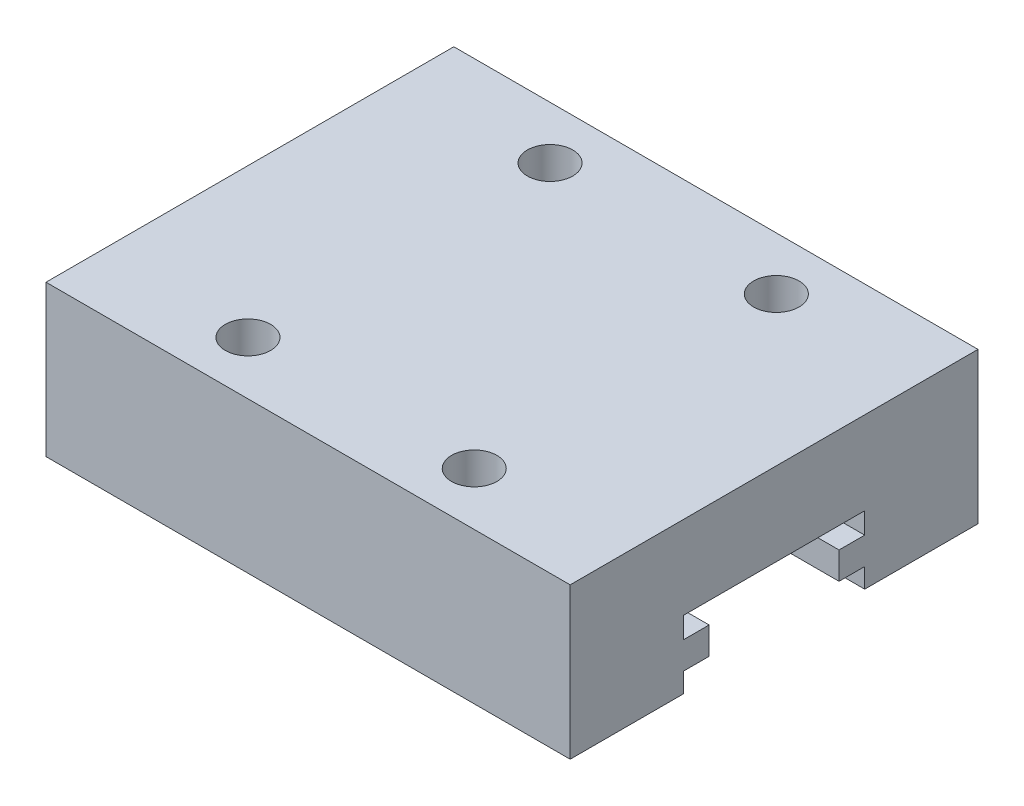
ISO-10303-21;
HEADER;
FILE_DESCRIPTION(('STEP AP214'),'2;1');
FILE_NAME('part.step','',(''),(''),'','','');
FILE_SCHEMA(('AUTOMOTIVE_DESIGN { 1 0 10303 214 1 1 1 1 }'));
ENDSEC;
DATA;
#1=APPLICATION_CONTEXT('core data for automotive mechanical design processes');
#2=APPLICATION_PROTOCOL_DEFINITION('international standard','automotive_design',2000,#1);
#3=PRODUCT_CONTEXT('',#1,'mechanical');
#4=PRODUCT('Part','Part','',(#3));
#5=PRODUCT_RELATED_PRODUCT_CATEGORY('part','',(#4));
#6=PRODUCT_DEFINITION_FORMATION('','',#4);
#7=PRODUCT_DEFINITION_CONTEXT('part definition',#1,'design');
#8=PRODUCT_DEFINITION('design','',#6,#7);
#9=PRODUCT_DEFINITION_SHAPE('','',#8);
#10=(LENGTH_UNIT() NAMED_UNIT(*) SI_UNIT(.MILLI.,.METRE.));
#11=(NAMED_UNIT(*) PLANE_ANGLE_UNIT() SI_UNIT($,.RADIAN.));
#12=(NAMED_UNIT(*) SI_UNIT($,.STERADIAN.) SOLID_ANGLE_UNIT());
#13=UNCERTAINTY_MEASURE_WITH_UNIT(LENGTH_MEASURE(1.E-05),#10,'distance_accuracy_value','');
#14=(GEOMETRIC_REPRESENTATION_CONTEXT(3) GLOBAL_UNCERTAINTY_ASSIGNED_CONTEXT((#13)) GLOBAL_UNIT_ASSIGNED_CONTEXT((#10,
#11,#12)) REPRESENTATION_CONTEXT('',''));
#15=CARTESIAN_POINT('',(0.,0.,0.));
#16=DIRECTION('',(0.,0.,1.));
#17=DIRECTION('',(1.,0.,0.));
#18=AXIS2_PLACEMENT_3D('',#15,#16,#17);
#19=CARTESIAN_POINT('',(0.,0.,0.));
#20=DIRECTION('',(0.,-1.,0.));
#21=DIRECTION('',(0.,0.,-1.));
#22=AXIS2_PLACEMENT_3D('',#19,#20,#21);
#23=PLANE('',#22);
#24=DIRECTION('',(1.,0.,0.));
#25=VECTOR('',#24,1.);
#26=CARTESIAN_POINT('',(-12.8160056179763,0.,-7.5));
#27=LINE('',#26,#25);
#28=CARTESIAN_POINT('',(0.,0.,-7.5));
#29=VERTEX_POINT('',#28);
#30=CARTESIAN_POINT('',(34.7,0.,-7.5));
#31=VERTEX_POINT('',#30);
#32=EDGE_CURVE('E192',#29,#31,#27,.T.);
#33=ORIENTED_EDGE('',*,*,#32,.T.);
#34=DIRECTION('',(0.,0.,-1.));
#35=VECTOR('',#34,1.);
#36=CARTESIAN_POINT('',(34.7,0.,0.));
#37=LINE('',#36,#35);
#38=CARTESIAN_POINT('',(34.7,0.,0.));
#39=VERTEX_POINT('',#38);
#40=EDGE_CURVE('E207',#39,#31,#37,.T.);
#41=ORIENTED_EDGE('',*,*,#40,.F.);
#42=DIRECTION('',(1.,0.,0.));
#43=VECTOR('',#42,1.);
#44=CARTESIAN_POINT('',(0.,0.,0.));
#45=LINE('',#44,#43);
#46=CARTESIAN_POINT('',(0.,0.,0.));
#47=VERTEX_POINT('',#46);
#48=EDGE_CURVE('E224',#47,#39,#45,.T.);
#49=ORIENTED_EDGE('',*,*,#48,.F.);
#50=DIRECTION('',(0.,0.,1.));
#51=VECTOR('',#50,1.);
#52=CARTESIAN_POINT('',(0.,0.,0.));
#53=LINE('',#52,#51);
#54=EDGE_CURVE('E208',#29,#47,#53,.T.);
#55=ORIENTED_EDGE('',*,*,#54,.F.);
#56=EDGE_LOOP('',(#33,#41,#49,#55));
#57=FACE_BOUND('',#56,.T.);
#58=ADVANCED_FACE('F40',(#57),#23,.T.);
#59=CARTESIAN_POINT('',(0.,10.,0.));
#60=DIRECTION('',(1.,0.,0.));
#61=DIRECTION('',(0.,0.,-1.));
#62=AXIS2_PLACEMENT_3D('',#59,#60,#61);
#63=PLANE('',#62);
#64=DIRECTION('',(0.,0.,-1.));
#65=VECTOR('',#64,1.);
#66=CARTESIAN_POINT('',(0.,1.3,-7.5));
#67=LINE('',#66,#65);
#68=CARTESIAN_POINT('',(0.,1.3,-7.5));
#69=VERTEX_POINT('',#68);
#70=CARTESIAN_POINT('',(0.,1.3,-9.2));
#71=VERTEX_POINT('',#70);
#72=EDGE_CURVE('E401',#69,#71,#67,.T.);
#73=ORIENTED_EDGE('',*,*,#72,.F.);
#74=DIRECTION('',(0.,1.,0.));
#75=VECTOR('',#74,1.);
#76=CARTESIAN_POINT('',(0.,0.,-7.5));
#77=LINE('',#76,#75);
#78=EDGE_CURVE('E267',#29,#69,#77,.T.);
#79=ORIENTED_EDGE('',*,*,#78,.F.);
#80=ORIENTED_EDGE('',*,*,#54,.T.);
#81=DIRECTION('',(0.,-1.,0.));
#82=VECTOR('',#81,1.);
#83=CARTESIAN_POINT('',(0.,10.,0.));
#84=LINE('',#83,#82);
#85=CARTESIAN_POINT('',(0.,10.,0.));
#86=VERTEX_POINT('',#85);
#87=EDGE_CURVE('E11',#86,#47,#84,.T.);
#88=ORIENTED_EDGE('',*,*,#87,.F.);
#89=DIRECTION('',(0.,0.,1.));
#90=VECTOR('',#89,1.);
#91=CARTESIAN_POINT('',(0.,10.,0.));
#92=LINE('',#91,#90);
#93=CARTESIAN_POINT('',(0.,10.,-27.));
#94=VERTEX_POINT('',#93);
#95=EDGE_CURVE('E221',#94,#86,#92,.T.);
#96=ORIENTED_EDGE('',*,*,#95,.F.);
#97=DIRECTION('',(0.,-1.,0.));
#98=VECTOR('',#97,1.);
#99=CARTESIAN_POINT('',(0.,10.,-27.));
#100=LINE('',#99,#98);
#101=CARTESIAN_POINT('',(0.,0.,-27.));
#102=VERTEX_POINT('',#101);
#103=EDGE_CURVE('E228',#94,#102,#100,.T.);
#104=ORIENTED_EDGE('',*,*,#103,.T.);
#105=CARTESIAN_POINT('',(0.,0.,-19.5));
#106=VERTEX_POINT('',#105);
#107=EDGE_CURVE('E238',#102,#106,#53,.T.);
#108=ORIENTED_EDGE('',*,*,#107,.T.);
#109=DIRECTION('',(0.,-1.,0.));
#110=VECTOR('',#109,1.);
#111=CARTESIAN_POINT('',(0.,0.,-19.5));
#112=LINE('',#111,#110);
#113=CARTESIAN_POINT('',(0.,1.3,-19.5));
#114=VERTEX_POINT('',#113);
#115=EDGE_CURVE('E59',#114,#106,#112,.T.);
#116=ORIENTED_EDGE('',*,*,#115,.F.);
#117=DIRECTION('',(0.,0.,-1.));
#118=VECTOR('',#117,1.);
#119=CARTESIAN_POINT('',(0.,1.3,-19.5));
#120=LINE('',#119,#118);
#121=CARTESIAN_POINT('',(0.,1.3,-17.8));
#122=VERTEX_POINT('',#121);
#123=EDGE_CURVE('E375',#122,#114,#120,.T.);
#124=ORIENTED_EDGE('',*,*,#123,.F.);
#125=DIRECTION('',(0.,-1.,0.));
#126=VECTOR('',#125,1.);
#127=CARTESIAN_POINT('',(0.,3.1,-17.8));
#128=LINE('',#127,#126);
#129=CARTESIAN_POINT('',(0.,3.1,-17.8));
#130=VERTEX_POINT('',#129);
#131=EDGE_CURVE('E381',#130,#122,#128,.T.);
#132=ORIENTED_EDGE('',*,*,#131,.F.);
#133=DIRECTION('',(0.,0.,1.));
#134=VECTOR('',#133,1.);
#135=CARTESIAN_POINT('',(0.,3.1,-19.5));
#136=LINE('',#135,#134);
#137=CARTESIAN_POINT('',(0.,3.1,-19.5));
#138=VERTEX_POINT('',#137);
#139=EDGE_CURVE('E388',#138,#130,#136,.T.);
#140=ORIENTED_EDGE('',*,*,#139,.F.);
#141=DIRECTION('',(0.,-1.,0.));
#142=VECTOR('',#141,1.);
#143=CARTESIAN_POINT('',(0.,3.1,-19.5));
#144=LINE('',#143,#142);
#145=CARTESIAN_POINT('',(0.,4.5,-19.5));
#146=VERTEX_POINT('',#145);
#147=EDGE_CURVE('E263',#146,#138,#144,.T.);
#148=ORIENTED_EDGE('',*,*,#147,.F.);
#149=DIRECTION('',(0.,0.,-1.));
#150=VECTOR('',#149,1.);
#151=CARTESIAN_POINT('',(0.,4.5,-7.5));
#152=LINE('',#151,#150);
#153=CARTESIAN_POINT('',(0.,4.5,-7.5));
#154=VERTEX_POINT('',#153);
#155=EDGE_CURVE('E260',#154,#146,#152,.T.);
#156=ORIENTED_EDGE('',*,*,#155,.F.);
#157=DIRECTION('',(0.,1.,0.));
#158=VECTOR('',#157,1.);
#159=CARTESIAN_POINT('',(0.,3.1,-7.5));
#160=LINE('',#159,#158);
#161=CARTESIAN_POINT('',(0.,3.1,-7.5));
#162=VERTEX_POINT('',#161);
#163=EDGE_CURVE('E262',#162,#154,#160,.T.);
#164=ORIENTED_EDGE('',*,*,#163,.F.);
#165=DIRECTION('',(0.,0.,1.));
#166=VECTOR('',#165,1.);
#167=CARTESIAN_POINT('',(0.,3.1,-7.5));
#168=LINE('',#167,#166);
#169=CARTESIAN_POINT('',(0.,3.1,-9.2));
#170=VERTEX_POINT('',#169);
#171=EDGE_CURVE('E395',#170,#162,#168,.T.);
#172=ORIENTED_EDGE('',*,*,#171,.F.);
#173=DIRECTION('',(0.,1.,0.));
#174=VECTOR('',#173,1.);
#175=CARTESIAN_POINT('',(0.,3.1,-9.2));
#176=LINE('',#175,#174);
#177=EDGE_CURVE('E398',#71,#170,#176,.T.);
#178=ORIENTED_EDGE('',*,*,#177,.F.);
#179=EDGE_LOOP('',(#73,#79,#80,#88,#96,#104,#108,#116,#124,#132,#140,#148,#156,#164,#172,#178));
#180=FACE_BOUND('',#179,.T.);
#181=ADVANCED_FACE('F42',(#180),#63,.F.);
#182=CARTESIAN_POINT('',(0.,10.,0.));
#183=DIRECTION('',(0.,0.,-1.));
#184=DIRECTION('',(-1.,0.,0.));
#185=AXIS2_PLACEMENT_3D('',#182,#183,#184);
#186=PLANE('',#185);
#187=ORIENTED_EDGE('',*,*,#48,.T.);
#188=DIRECTION('',(0.,-1.,0.));
#189=VECTOR('',#188,1.);
#190=CARTESIAN_POINT('',(34.7,10.,0.));
#191=LINE('',#190,#189);
#192=CARTESIAN_POINT('',(34.7,10.,0.));
#193=VERTEX_POINT('',#192);
#194=EDGE_CURVE('E49',#193,#39,#191,.T.);
#195=ORIENTED_EDGE('',*,*,#194,.F.);
#196=DIRECTION('',(1.,0.,0.));
#197=VECTOR('',#196,1.);
#198=CARTESIAN_POINT('',(0.,10.,0.));
#199=LINE('',#198,#197);
#200=EDGE_CURVE('E100',#86,#193,#199,.T.);
#201=ORIENTED_EDGE('',*,*,#200,.F.);
#202=ORIENTED_EDGE('',*,*,#87,.T.);
#203=EDGE_LOOP('',(#187,#195,#201,#202));
#204=FACE_BOUND('',#203,.T.);
#205=ADVANCED_FACE('F337',(#204),#186,.F.);
#206=CARTESIAN_POINT('',(34.7,10.,0.));
#207=DIRECTION('',(-1.,0.,0.));
#208=DIRECTION('',(0.,0.,1.));
#209=AXIS2_PLACEMENT_3D('',#206,#207,#208);
#210=PLANE('',#209);
#211=ORIENTED_EDGE('',*,*,#40,.T.);
#212=DIRECTION('',(0.,-1.,0.));
#213=VECTOR('',#212,1.);
#214=CARTESIAN_POINT('',(34.7,0.,-7.5));
#215=LINE('',#214,#213);
#216=CARTESIAN_POINT('',(34.7,1.3,-7.5));
#217=VERTEX_POINT('',#216);
#218=EDGE_CURVE('E189',#217,#31,#215,.T.);
#219=ORIENTED_EDGE('',*,*,#218,.F.);
#220=DIRECTION('',(0.,0.,1.));
#221=VECTOR('',#220,1.);
#222=CARTESIAN_POINT('',(34.7,1.3,-7.5));
#223=LINE('',#222,#221);
#224=CARTESIAN_POINT('',(34.7,1.3,-9.2));
#225=VERTEX_POINT('',#224);
#226=EDGE_CURVE('E211',#225,#217,#223,.T.);
#227=ORIENTED_EDGE('',*,*,#226,.F.);
#228=DIRECTION('',(0.,-1.,0.));
#229=VECTOR('',#228,1.);
#230=CARTESIAN_POINT('',(34.7,3.1,-9.2));
#231=LINE('',#230,#229);
#232=CARTESIAN_POINT('',(34.7,3.1,-9.2));
#233=VERTEX_POINT('',#232);
#234=EDGE_CURVE('E409',#233,#225,#231,.T.);
#235=ORIENTED_EDGE('',*,*,#234,.F.);
#236=DIRECTION('',(0.,0.,-1.));
#237=VECTOR('',#236,1.);
#238=CARTESIAN_POINT('',(34.7,3.1,-7.5));
#239=LINE('',#238,#237);
#240=CARTESIAN_POINT('',(34.7,3.1,-7.5));
#241=VERTEX_POINT('',#240);
#242=EDGE_CURVE('E406',#241,#233,#239,.T.);
#243=ORIENTED_EDGE('',*,*,#242,.F.);
#244=DIRECTION('',(0.,-1.,0.));
#245=VECTOR('',#244,1.);
#246=CARTESIAN_POINT('',(34.7,3.1,-7.5));
#247=LINE('',#246,#245);
#248=CARTESIAN_POINT('',(34.7,4.5,-7.5));
#249=VERTEX_POINT('',#248);
#250=EDGE_CURVE('E235',#249,#241,#247,.T.);
#251=ORIENTED_EDGE('',*,*,#250,.F.);
#252=DIRECTION('',(0.,0.,1.));
#253=VECTOR('',#252,1.);
#254=CARTESIAN_POINT('',(34.7,4.5,-7.5));
#255=LINE('',#254,#253);
#256=CARTESIAN_POINT('',(34.7,4.5,-19.5));
#257=VERTEX_POINT('',#256);
#258=EDGE_CURVE('E255',#257,#249,#255,.T.);
#259=ORIENTED_EDGE('',*,*,#258,.F.);
#260=DIRECTION('',(0.,1.,0.));
#261=VECTOR('',#260,1.);
#262=CARTESIAN_POINT('',(34.7,3.1,-19.5));
#263=LINE('',#262,#261);
#264=CARTESIAN_POINT('',(34.7,3.1,-19.5));
#265=VERTEX_POINT('',#264);
#266=EDGE_CURVE('E258',#265,#257,#263,.T.);
#267=ORIENTED_EDGE('',*,*,#266,.F.);
#268=DIRECTION('',(0.,0.,-1.));
#269=VECTOR('',#268,1.);
#270=CARTESIAN_POINT('',(34.7,3.1,-19.5));
#271=LINE('',#270,#269);
#272=CARTESIAN_POINT('',(34.7,3.1,-17.8));
#273=VERTEX_POINT('',#272);
#274=EDGE_CURVE('E276',#273,#265,#271,.T.);
#275=ORIENTED_EDGE('',*,*,#274,.F.);
#276=DIRECTION('',(0.,1.,0.));
#277=VECTOR('',#276,1.);
#278=CARTESIAN_POINT('',(34.7,3.1,-17.8));
#279=LINE('',#278,#277);
#280=CARTESIAN_POINT('',(34.7,1.3,-17.8));
#281=VERTEX_POINT('',#280);
#282=EDGE_CURVE('E272',#281,#273,#279,.T.);
#283=ORIENTED_EDGE('',*,*,#282,.F.);
#284=DIRECTION('',(0.,0.,1.));
#285=VECTOR('',#284,1.);
#286=CARTESIAN_POINT('',(34.7,1.3,-19.5));
#287=LINE('',#286,#285);
#288=CARTESIAN_POINT('',(34.7,1.3,-19.5));
#289=VERTEX_POINT('',#288);
#290=EDGE_CURVE('E269',#289,#281,#287,.T.);
#291=ORIENTED_EDGE('',*,*,#290,.F.);
#292=DIRECTION('',(0.,1.,0.));
#293=VECTOR('',#292,1.);
#294=CARTESIAN_POINT('',(34.7,0.,-19.5));
#295=LINE('',#294,#293);
#296=CARTESIAN_POINT('',(34.7,0.,-19.5));
#297=VERTEX_POINT('',#296);
#298=EDGE_CURVE('E201',#297,#289,#295,.T.);
#299=ORIENTED_EDGE('',*,*,#298,.F.);
#300=CARTESIAN_POINT('',(34.7,0.,-27.));
#301=VERTEX_POINT('',#300);
#302=EDGE_CURVE('E217',#297,#301,#37,.T.);
#303=ORIENTED_EDGE('',*,*,#302,.T.);
#304=DIRECTION('',(0.,-1.,0.));
#305=VECTOR('',#304,1.);
#306=CARTESIAN_POINT('',(34.7,10.,-27.));
#307=LINE('',#306,#305);
#308=CARTESIAN_POINT('',(34.7,10.,-27.));
#309=VERTEX_POINT('',#308);
#310=EDGE_CURVE('E231',#309,#301,#307,.T.);
#311=ORIENTED_EDGE('',*,*,#310,.F.);
#312=DIRECTION('',(0.,0.,-1.));
#313=VECTOR('',#312,1.);
#314=CARTESIAN_POINT('',(34.7,10.,0.));
#315=LINE('',#314,#313);
#316=EDGE_CURVE('E278',#193,#309,#315,.T.);
#317=ORIENTED_EDGE('',*,*,#316,.F.);
#318=ORIENTED_EDGE('',*,*,#194,.T.);
#319=EDGE_LOOP('',(#211,#219,#227,#235,#243,#251,#259,#267,#275,#283,#291,#299,#303,#311,#317,#318));
#320=FACE_BOUND('',#319,.T.);
#321=ADVANCED_FACE('F214',(#320),#210,.F.);
#322=CARTESIAN_POINT('',(0.,10.,-27.));
#323=DIRECTION('',(0.,0.,1.));
#324=DIRECTION('',(1.,0.,0.));
#325=AXIS2_PLACEMENT_3D('',#322,#323,#324);
#326=PLANE('',#325);
#327=DIRECTION('',(-1.,0.,0.));
#328=VECTOR('',#327,1.);
#329=CARTESIAN_POINT('',(0.,0.,-27.));
#330=LINE('',#329,#328);
#331=EDGE_CURVE('E93',#301,#102,#330,.T.);
#332=ORIENTED_EDGE('',*,*,#331,.T.);
#333=ORIENTED_EDGE('',*,*,#103,.F.);
#334=DIRECTION('',(-1.,0.,0.));
#335=VECTOR('',#334,1.);
#336=CARTESIAN_POINT('',(0.,10.,-27.));
#337=LINE('',#336,#335);
#338=EDGE_CURVE('E68',#309,#94,#337,.T.);
#339=ORIENTED_EDGE('',*,*,#338,.F.);
#340=ORIENTED_EDGE('',*,*,#310,.T.);
#341=EDGE_LOOP('',(#332,#333,#339,#340));
#342=FACE_BOUND('',#341,.T.);
#343=ADVANCED_FACE('F343',(#342),#326,.F.);
#344=CARTESIAN_POINT('',(0.,10.,0.));
#345=DIRECTION('',(0.,-1.,0.));
#346=DIRECTION('',(0.,0.,-1.));
#347=AXIS2_PLACEMENT_3D('',#344,#345,#346);
#348=PLANE('',#347);
#349=CARTESIAN_POINT('',(24.8499864669187,10.,-23.5));
#350=DIRECTION('',(0.,1.,0.));
#351=DIRECTION('',(0.,0.,1.));
#352=AXIS2_PLACEMENT_3D('',#349,#350,#351);
#353=CIRCLE('',#352,1.5);
#354=CARTESIAN_POINT('',(24.8499864669187,10.,-22.));
#355=VERTEX_POINT('',#354);
#356=EDGE_CURVE('E242',#355,#355,#353,.T.);
#357=ORIENTED_EDGE('',*,*,#356,.F.);
#358=EDGE_LOOP('',(#357));
#359=FACE_BOUND('',#358,.T.);
#360=CARTESIAN_POINT('',(9.85,10.,-3.52014924954561));
#361=DIRECTION('',(0.,1.,0.));
#362=DIRECTION('',(0.,0.,1.));
#363=AXIS2_PLACEMENT_3D('',#360,#361,#362);
#364=CIRCLE('',#363,1.5);
#365=CARTESIAN_POINT('',(9.85,10.,-2.02014924954561));
#366=VERTEX_POINT('',#365);
#367=EDGE_CURVE('E243',#366,#366,#364,.T.);
#368=ORIENTED_EDGE('',*,*,#367,.F.);
#369=EDGE_LOOP('',(#368));
#370=FACE_BOUND('',#369,.T.);
#371=CARTESIAN_POINT('',(24.8499864669187,10.,-3.5));
#372=DIRECTION('',(0.,1.,0.));
#373=DIRECTION('',(0.,0.,1.));
#374=AXIS2_PLACEMENT_3D('',#371,#372,#373);
#375=CIRCLE('',#374,1.5);
#376=CARTESIAN_POINT('',(24.8499864669187,10.,-2.));
#377=VERTEX_POINT('',#376);
#378=EDGE_CURVE('E248',#377,#377,#375,.T.);
#379=ORIENTED_EDGE('',*,*,#378,.F.);
#380=EDGE_LOOP('',(#379));
#381=FACE_BOUND('',#380,.T.);
#382=CARTESIAN_POINT('',(9.85,10.,-23.5201492495456));
#383=DIRECTION('',(0.,1.,0.));
#384=DIRECTION('',(0.,0.,1.));
#385=AXIS2_PLACEMENT_3D('',#382,#383,#384);
#386=CIRCLE('',#385,1.5);
#387=CARTESIAN_POINT('',(9.85,10.,-22.0201492495456));
#388=VERTEX_POINT('',#387);
#389=EDGE_CURVE('E318',#388,#388,#386,.T.);
#390=ORIENTED_EDGE('',*,*,#389,.F.);
#391=EDGE_LOOP('',(#390));
#392=FACE_BOUND('',#391,.T.);
#393=ORIENTED_EDGE('',*,*,#95,.T.);
#394=ORIENTED_EDGE('',*,*,#200,.T.);
#395=ORIENTED_EDGE('',*,*,#316,.T.);
#396=ORIENTED_EDGE('',*,*,#338,.T.);
#397=EDGE_LOOP('',(#393,#394,#395,#396));
#398=FACE_BOUND('',#397,.T.);
#399=ADVANCED_FACE('F354',(#359,#370,#381,#392,#398),#348,.F.);
#400=DIRECTION('',(1.,0.,0.));
#401=VECTOR('',#400,1.);
#402=CARTESIAN_POINT('',(-12.8160056179763,0.,-19.5));
#403=LINE('',#402,#401);
#404=EDGE_CURVE('E210',#106,#297,#403,.T.);
#405=ORIENTED_EDGE('',*,*,#404,.F.);
#406=ORIENTED_EDGE('',*,*,#107,.F.);
#407=ORIENTED_EDGE('',*,*,#331,.F.);
#408=ORIENTED_EDGE('',*,*,#302,.F.);
#409=EDGE_LOOP('',(#405,#406,#407,#408));
#410=FACE_BOUND('',#409,.T.);
#411=ADVANCED_FACE('F347',(#410),#23,.T.);
#412=CARTESIAN_POINT('',(9.85,5.,-23.5201492495456));
#413=DIRECTION('',(0.,1.,0.));
#414=DIRECTION('',(0.,0.,1.));
#415=AXIS2_PLACEMENT_3D('',#412,#413,#414);
#416=CYLINDRICAL_SURFACE('',#415,1.5);
#417=CARTESIAN_POINT('',(9.85,5.,-23.5201492495456));
#418=DIRECTION('',(0.,1.,0.));
#419=DIRECTION('',(0.,0.,1.));
#420=AXIS2_PLACEMENT_3D('',#417,#418,#419);
#421=CIRCLE('',#420,1.5);
#422=CARTESIAN_POINT('',(9.85,5.,-22.0201492495456));
#423=VERTEX_POINT('',#422);
#424=EDGE_CURVE('E321',#423,#423,#421,.T.);
#425=ORIENTED_EDGE('',*,*,#424,.F.);
#426=EDGE_LOOP('',(#425));
#427=FACE_BOUND('',#426,.T.);
#428=ORIENTED_EDGE('',*,*,#389,.T.);
#429=EDGE_LOOP('',(#428));
#430=FACE_BOUND('',#429,.T.);
#431=ADVANCED_FACE('F353',(#427,#430),#416,.F.);
#432=CARTESIAN_POINT('',(9.85,5.,-23.5201492495456));
#433=DIRECTION('',(0.,1.,0.));
#434=DIRECTION('',(0.,0.,1.));
#435=AXIS2_PLACEMENT_3D('',#432,#433,#434);
#436=PLANE('',#435);
#437=ORIENTED_EDGE('',*,*,#424,.T.);
#438=EDGE_LOOP('',(#437));
#439=FACE_BOUND('',#438,.T.);
#440=ADVANCED_FACE('F360',(#439),#436,.T.);
#441=CARTESIAN_POINT('',(24.8499864669187,5.,-3.5));
#442=DIRECTION('',(0.,1.,0.));
#443=DIRECTION('',(0.,0.,1.));
#444=AXIS2_PLACEMENT_3D('',#441,#442,#443);
#445=CYLINDRICAL_SURFACE('',#444,1.5);
#446=CARTESIAN_POINT('',(24.8499864669187,5.,-3.5));
#447=DIRECTION('',(0.,1.,0.));
#448=DIRECTION('',(0.,0.,1.));
#449=AXIS2_PLACEMENT_3D('',#446,#447,#448);
#450=CIRCLE('',#449,1.5);
#451=CARTESIAN_POINT('',(24.8499864669187,5.,-2.));
#452=VERTEX_POINT('',#451);
#453=EDGE_CURVE('E245',#452,#452,#450,.T.);
#454=ORIENTED_EDGE('',*,*,#453,.F.);
#455=EDGE_LOOP('',(#454));
#456=FACE_BOUND('',#455,.T.);
#457=ORIENTED_EDGE('',*,*,#378,.T.);
#458=EDGE_LOOP('',(#457));
#459=FACE_BOUND('',#458,.T.);
#460=ADVANCED_FACE('F469',(#456,#459),#445,.F.);
#461=CARTESIAN_POINT('',(24.8499864669187,5.,-3.5));
#462=DIRECTION('',(0.,1.,0.));
#463=DIRECTION('',(0.,0.,1.));
#464=AXIS2_PLACEMENT_3D('',#461,#462,#463);
#465=PLANE('',#464);
#466=ORIENTED_EDGE('',*,*,#453,.T.);
#467=EDGE_LOOP('',(#466));
#468=FACE_BOUND('',#467,.T.);
#469=ADVANCED_FACE('F465',(#468),#465,.T.);
#470=CARTESIAN_POINT('',(9.85,5.,-3.52014924954561));
#471=DIRECTION('',(0.,1.,0.));
#472=DIRECTION('',(0.,0.,1.));
#473=AXIS2_PLACEMENT_3D('',#470,#471,#472);
#474=CYLINDRICAL_SURFACE('',#473,1.5);
#475=CARTESIAN_POINT('',(9.85,5.,-3.52014924954561));
#476=DIRECTION('',(0.,1.,0.));
#477=DIRECTION('',(0.,0.,1.));
#478=AXIS2_PLACEMENT_3D('',#475,#476,#477);
#479=CIRCLE('',#478,1.5);
#480=CARTESIAN_POINT('',(9.85,5.,-2.02014924954561));
#481=VERTEX_POINT('',#480);
#482=EDGE_CURVE('E239',#481,#481,#479,.T.);
#483=ORIENTED_EDGE('',*,*,#482,.F.);
#484=EDGE_LOOP('',(#483));
#485=FACE_BOUND('',#484,.T.);
#486=ORIENTED_EDGE('',*,*,#367,.T.);
#487=EDGE_LOOP('',(#486));
#488=FACE_BOUND('',#487,.T.);
#489=ADVANCED_FACE('F468',(#485,#488),#474,.F.);
#490=CARTESIAN_POINT('',(9.85,5.,-3.52014924954561));
#491=DIRECTION('',(0.,1.,0.));
#492=DIRECTION('',(0.,0.,1.));
#493=AXIS2_PLACEMENT_3D('',#490,#491,#492);
#494=PLANE('',#493);
#495=ORIENTED_EDGE('',*,*,#482,.T.);
#496=EDGE_LOOP('',(#495));
#497=FACE_BOUND('',#496,.T.);
#498=ADVANCED_FACE('F480',(#497),#494,.T.);
#499=CARTESIAN_POINT('',(24.8499864669187,5.,-23.5));
#500=DIRECTION('',(0.,1.,0.));
#501=DIRECTION('',(0.,0.,1.));
#502=AXIS2_PLACEMENT_3D('',#499,#500,#501);
#503=CYLINDRICAL_SURFACE('',#502,1.5);
#504=CARTESIAN_POINT('',(24.8499864669187,5.,-23.5));
#505=DIRECTION('',(0.,1.,0.));
#506=DIRECTION('',(0.,0.,1.));
#507=AXIS2_PLACEMENT_3D('',#504,#505,#506);
#508=CIRCLE('',#507,1.5);
#509=CARTESIAN_POINT('',(24.8499864669187,5.,-22.));
#510=VERTEX_POINT('',#509);
#511=EDGE_CURVE('E315',#510,#510,#508,.T.);
#512=ORIENTED_EDGE('',*,*,#511,.F.);
#513=EDGE_LOOP('',(#512));
#514=FACE_BOUND('',#513,.T.);
#515=ORIENTED_EDGE('',*,*,#356,.T.);
#516=EDGE_LOOP('',(#515));
#517=FACE_BOUND('',#516,.T.);
#518=ADVANCED_FACE('F476',(#514,#517),#503,.F.);
#519=CARTESIAN_POINT('',(24.8499864669187,5.,-23.5));
#520=DIRECTION('',(0.,1.,0.));
#521=DIRECTION('',(0.,0.,1.));
#522=AXIS2_PLACEMENT_3D('',#519,#520,#521);
#523=PLANE('',#522);
#524=ORIENTED_EDGE('',*,*,#511,.T.);
#525=EDGE_LOOP('',(#524));
#526=FACE_BOUND('',#525,.T.);
#527=ADVANCED_FACE('F464',(#526),#523,.T.);
#528=CARTESIAN_POINT('',(-12.8160056179763,0.,-7.5));
#529=DIRECTION('',(0.,0.,1.));
#530=DIRECTION('',(0.,-1.,0.));
#531=AXIS2_PLACEMENT_3D('',#528,#529,#530);
#532=PLANE('',#531);
#533=ORIENTED_EDGE('',*,*,#78,.T.);
#534=DIRECTION('',(1.,0.,0.));
#535=VECTOR('',#534,1.);
#536=CARTESIAN_POINT('',(-12.8160056179763,1.3,-7.5));
#537=LINE('',#536,#535);
#538=EDGE_CURVE('E195',#69,#217,#537,.T.);
#539=ORIENTED_EDGE('',*,*,#538,.T.);
#540=ORIENTED_EDGE('',*,*,#218,.T.);
#541=ORIENTED_EDGE('',*,*,#32,.F.);
#542=EDGE_LOOP('',(#533,#539,#540,#541));
#543=FACE_BOUND('',#542,.T.);
#544=ADVANCED_FACE('F191',(#543),#532,.F.);
#545=CARTESIAN_POINT('',(-12.8160056179763,1.3,-7.5));
#546=DIRECTION('',(0.,1.,0.));
#547=DIRECTION('',(0.,0.,1.));
#548=AXIS2_PLACEMENT_3D('',#545,#546,#547);
#549=PLANE('',#548);
#550=ORIENTED_EDGE('',*,*,#72,.T.);
#551=DIRECTION('',(1.,0.,0.));
#552=VECTOR('',#551,1.);
#553=CARTESIAN_POINT('',(-12.8160056179763,1.3,-9.2));
#554=LINE('',#553,#552);
#555=EDGE_CURVE('E384',#71,#225,#554,.T.);
#556=ORIENTED_EDGE('',*,*,#555,.T.);
#557=ORIENTED_EDGE('',*,*,#226,.T.);
#558=ORIENTED_EDGE('',*,*,#538,.F.);
#559=EDGE_LOOP('',(#550,#556,#557,#558));
#560=FACE_BOUND('',#559,.T.);
#561=ADVANCED_FACE('F463',(#560),#549,.F.);
#562=CARTESIAN_POINT('',(-12.8160056179763,3.1,-9.2));
#563=DIRECTION('',(0.,0.,1.));
#564=DIRECTION('',(0.,-1.,0.));
#565=AXIS2_PLACEMENT_3D('',#562,#563,#564);
#566=PLANE('',#565);
#567=ORIENTED_EDGE('',*,*,#177,.T.);
#568=DIRECTION('',(1.,0.,0.));
#569=VECTOR('',#568,1.);
#570=CARTESIAN_POINT('',(-12.8160056179763,3.1,-9.2));
#571=LINE('',#570,#569);
#572=EDGE_CURVE('E416',#170,#233,#571,.T.);
#573=ORIENTED_EDGE('',*,*,#572,.T.);
#574=ORIENTED_EDGE('',*,*,#234,.T.);
#575=ORIENTED_EDGE('',*,*,#555,.F.);
#576=EDGE_LOOP('',(#567,#573,#574,#575));
#577=FACE_BOUND('',#576,.T.);
#578=ADVANCED_FACE('F434',(#577),#566,.F.);
#579=CARTESIAN_POINT('',(-12.8160056179763,3.1,-7.5));
#580=DIRECTION('',(0.,-1.,0.));
#581=DIRECTION('',(0.,0.,-1.));
#582=AXIS2_PLACEMENT_3D('',#579,#580,#581);
#583=PLANE('',#582);
#584=ORIENTED_EDGE('',*,*,#171,.T.);
#585=DIRECTION('',(1.,0.,0.));
#586=VECTOR('',#585,1.);
#587=CARTESIAN_POINT('',(-12.8160056179763,3.1,-7.5));
#588=LINE('',#587,#586);
#589=EDGE_CURVE('E252',#162,#241,#588,.T.);
#590=ORIENTED_EDGE('',*,*,#589,.T.);
#591=ORIENTED_EDGE('',*,*,#242,.T.);
#592=ORIENTED_EDGE('',*,*,#572,.F.);
#593=EDGE_LOOP('',(#584,#590,#591,#592));
#594=FACE_BOUND('',#593,.T.);
#595=ADVANCED_FACE('F421',(#594),#583,.F.);
#596=CARTESIAN_POINT('',(-12.8160056179763,3.1,-7.5));
#597=DIRECTION('',(0.,0.,1.));
#598=DIRECTION('',(0.,-1.,0.));
#599=AXIS2_PLACEMENT_3D('',#596,#597,#598);
#600=PLANE('',#599);
#601=ORIENTED_EDGE('',*,*,#163,.T.);
#602=DIRECTION('',(1.,0.,0.));
#603=VECTOR('',#602,1.);
#604=CARTESIAN_POINT('',(-12.8160056179763,4.5,-7.5));
#605=LINE('',#604,#603);
#606=EDGE_CURVE('E250',#154,#249,#605,.T.);
#607=ORIENTED_EDGE('',*,*,#606,.T.);
#608=ORIENTED_EDGE('',*,*,#250,.T.);
#609=ORIENTED_EDGE('',*,*,#589,.F.);
#610=EDGE_LOOP('',(#601,#607,#608,#609));
#611=FACE_BOUND('',#610,.T.);
#612=ADVANCED_FACE('F429',(#611),#600,.F.);
#613=CARTESIAN_POINT('',(-12.8160056179763,4.5,-7.5));
#614=DIRECTION('',(0.,1.,0.));
#615=DIRECTION('',(0.,0.,1.));
#616=AXIS2_PLACEMENT_3D('',#613,#614,#615);
#617=PLANE('',#616);
#618=ORIENTED_EDGE('',*,*,#155,.T.);
#619=DIRECTION('',(1.,0.,0.));
#620=VECTOR('',#619,1.);
#621=CARTESIAN_POINT('',(-12.8160056179763,4.5,-19.5));
#622=LINE('',#621,#620);
#623=EDGE_CURVE('E253',#146,#257,#622,.T.);
#624=ORIENTED_EDGE('',*,*,#623,.T.);
#625=ORIENTED_EDGE('',*,*,#258,.T.);
#626=ORIENTED_EDGE('',*,*,#606,.F.);
#627=EDGE_LOOP('',(#618,#624,#625,#626));
#628=FACE_BOUND('',#627,.T.);
#629=ADVANCED_FACE('F438',(#628),#617,.F.);
#630=CARTESIAN_POINT('',(-12.8160056179763,3.1,-19.5));
#631=DIRECTION('',(0.,0.,-1.));
#632=DIRECTION('',(0.,1.,0.));
#633=AXIS2_PLACEMENT_3D('',#630,#631,#632);
#634=PLANE('',#633);
#635=ORIENTED_EDGE('',*,*,#147,.T.);
#636=DIRECTION('',(1.,0.,0.));
#637=VECTOR('',#636,1.);
#638=CARTESIAN_POINT('',(-12.8160056179763,3.1,-19.5));
#639=LINE('',#638,#637);
#640=EDGE_CURVE('E286',#138,#265,#639,.T.);
#641=ORIENTED_EDGE('',*,*,#640,.T.);
#642=ORIENTED_EDGE('',*,*,#266,.T.);
#643=ORIENTED_EDGE('',*,*,#623,.F.);
#644=EDGE_LOOP('',(#635,#641,#642,#643));
#645=FACE_BOUND('',#644,.T.);
#646=ADVANCED_FACE('F441',(#645),#634,.F.);
#647=CARTESIAN_POINT('',(-12.8160056179763,3.1,-19.5));
#648=DIRECTION('',(0.,-1.,0.));
#649=DIRECTION('',(0.,0.,-1.));
#650=AXIS2_PLACEMENT_3D('',#647,#648,#649);
#651=PLANE('',#650);
#652=ORIENTED_EDGE('',*,*,#139,.T.);
#653=DIRECTION('',(1.,0.,0.));
#654=VECTOR('',#653,1.);
#655=CARTESIAN_POINT('',(-12.8160056179763,3.1,-17.8));
#656=LINE('',#655,#654);
#657=EDGE_CURVE('E284',#130,#273,#656,.T.);
#658=ORIENTED_EDGE('',*,*,#657,.T.);
#659=ORIENTED_EDGE('',*,*,#274,.T.);
#660=ORIENTED_EDGE('',*,*,#640,.F.);
#661=EDGE_LOOP('',(#652,#658,#659,#660));
#662=FACE_BOUND('',#661,.T.);
#663=ADVANCED_FACE('F445',(#662),#651,.F.);
#664=CARTESIAN_POINT('',(-12.8160056179763,3.1,-17.8));
#665=DIRECTION('',(0.,0.,-1.));
#666=DIRECTION('',(0.,1.,0.));
#667=AXIS2_PLACEMENT_3D('',#664,#665,#666);
#668=PLANE('',#667);
#669=ORIENTED_EDGE('',*,*,#131,.T.);
#670=DIRECTION('',(1.,0.,0.));
#671=VECTOR('',#670,1.);
#672=CARTESIAN_POINT('',(-12.8160056179763,1.3,-17.8));
#673=LINE('',#672,#671);
#674=EDGE_CURVE('E287',#122,#281,#673,.T.);
#675=ORIENTED_EDGE('',*,*,#674,.T.);
#676=ORIENTED_EDGE('',*,*,#282,.T.);
#677=ORIENTED_EDGE('',*,*,#657,.F.);
#678=EDGE_LOOP('',(#669,#675,#676,#677));
#679=FACE_BOUND('',#678,.T.);
#680=ADVANCED_FACE('F448',(#679),#668,.F.);
#681=CARTESIAN_POINT('',(-12.8160056179763,1.3,-19.5));
#682=DIRECTION('',(0.,1.,0.));
#683=DIRECTION('',(0.,0.,1.));
#684=AXIS2_PLACEMENT_3D('',#681,#682,#683);
#685=PLANE('',#684);
#686=ORIENTED_EDGE('',*,*,#123,.T.);
#687=DIRECTION('',(1.,0.,0.));
#688=VECTOR('',#687,1.);
#689=CARTESIAN_POINT('',(-12.8160056179763,1.3,-19.5));
#690=LINE('',#689,#688);
#691=EDGE_CURVE('E310',#114,#289,#690,.T.);
#692=ORIENTED_EDGE('',*,*,#691,.T.);
#693=ORIENTED_EDGE('',*,*,#290,.T.);
#694=ORIENTED_EDGE('',*,*,#674,.F.);
#695=EDGE_LOOP('',(#686,#692,#693,#694));
#696=FACE_BOUND('',#695,.T.);
#697=ADVANCED_FACE('F373',(#696),#685,.F.);
#698=CARTESIAN_POINT('',(-12.8160056179763,0.,-19.5));
#699=DIRECTION('',(0.,0.,-1.));
#700=DIRECTION('',(0.,1.,0.));
#701=AXIS2_PLACEMENT_3D('',#698,#699,#700);
#702=PLANE('',#701);
#703=ORIENTED_EDGE('',*,*,#115,.T.);
#704=ORIENTED_EDGE('',*,*,#404,.T.);
#705=ORIENTED_EDGE('',*,*,#298,.T.);
#706=ORIENTED_EDGE('',*,*,#691,.F.);
#707=EDGE_LOOP('',(#703,#704,#705,#706));
#708=FACE_BOUND('',#707,.T.);
#709=ADVANCED_FACE('F366',(#708),#702,.F.);
#710=CLOSED_SHELL('',(#58,#181,#205,#321,#343,#399,#411,#431,#440,#460,#469,#489,#498,#518,#527,
#544,#561,#578,#595,#612,#629,#646,#663,#680,#697,#709));
#711=MANIFOLD_SOLID_BREP('B2',#710);
#712=ADVANCED_BREP_SHAPE_REPRESENTATION('',(#18,#711),#14);
#713=SHAPE_DEFINITION_REPRESENTATION(#9,#712);
ENDSEC;
END-ISO-10303-21;
